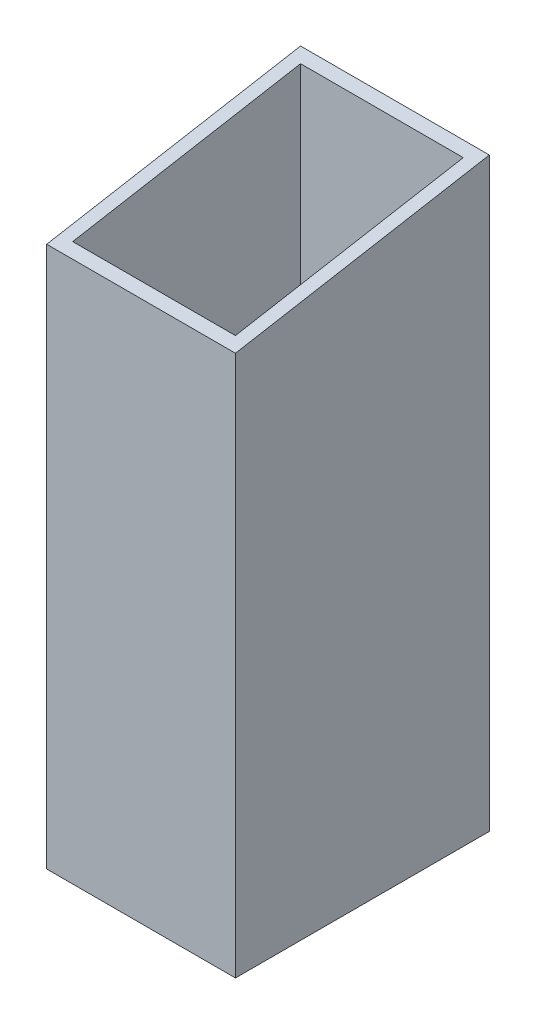
ISO-10303-21;
HEADER;
FILE_DESCRIPTION(('STEP AP214'),'2;1');
FILE_NAME('part.step','',(''),(''),'','','');
FILE_SCHEMA(('AUTOMOTIVE_DESIGN { 1 0 10303 214 1 1 1 1 }'));
ENDSEC;
DATA;
#1=APPLICATION_CONTEXT('core data for automotive mechanical design processes');
#2=APPLICATION_PROTOCOL_DEFINITION('international standard','automotive_design',2000,#1);
#3=PRODUCT_CONTEXT('',#1,'mechanical');
#4=PRODUCT('Part','Part','',(#3));
#5=PRODUCT_RELATED_PRODUCT_CATEGORY('part','',(#4));
#6=PRODUCT_DEFINITION_FORMATION('','',#4);
#7=PRODUCT_DEFINITION_CONTEXT('part definition',#1,'design');
#8=PRODUCT_DEFINITION('design','',#6,#7);
#9=PRODUCT_DEFINITION_SHAPE('','',#8);
#10=(LENGTH_UNIT() NAMED_UNIT(*) SI_UNIT(.MILLI.,.METRE.));
#11=(NAMED_UNIT(*) PLANE_ANGLE_UNIT() SI_UNIT($,.RADIAN.));
#12=(NAMED_UNIT(*) SI_UNIT($,.STERADIAN.) SOLID_ANGLE_UNIT());
#13=UNCERTAINTY_MEASURE_WITH_UNIT(LENGTH_MEASURE(1.E-05),#10,'distance_accuracy_value','');
#14=(GEOMETRIC_REPRESENTATION_CONTEXT(3) GLOBAL_UNCERTAINTY_ASSIGNED_CONTEXT((#13)) GLOBAL_UNIT_ASSIGNED_CONTEXT((#10,
#11,#12)) REPRESENTATION_CONTEXT('',''));
#15=CARTESIAN_POINT('',(0.,0.,0.));
#16=DIRECTION('',(0.,0.,1.));
#17=DIRECTION('',(1.,0.,0.));
#18=AXIS2_PLACEMENT_3D('',#15,#16,#17);
#19=CARTESIAN_POINT('',(0.,90.,0.));
#20=DIRECTION('',(1.,0.,0.));
#21=DIRECTION('',(0.,0.,-1.));
#22=AXIS2_PLACEMENT_3D('',#19,#20,#21);
#23=PLANE('',#22);
#24=DIRECTION('',(0.,-0.173648177666931,0.984807753012208));
#25=VECTOR('',#24,1.);
#26=CARTESIAN_POINT('',(0.,83.3306072051494,-1.1759938946748));
#27=LINE('',#26,#25);
#28=CARTESIAN_POINT('',(0.,90.,-39.));
#29=VERTEX_POINT('',#28);
#30=CARTESIAN_POINT('',(0.,83.1232477523698,0.));
#31=VERTEX_POINT('',#30);
#32=EDGE_CURVE('E121',#29,#31,#27,.T.);
#33=ORIENTED_EDGE('',*,*,#32,.F.);
#34=DIRECTION('',(0.,-1.,0.));
#35=VECTOR('',#34,1.);
#36=CARTESIAN_POINT('',(0.,90.,-39.));
#37=LINE('',#36,#35);
#38=CARTESIAN_POINT('',(0.,0.,-39.));
#39=VERTEX_POINT('',#38);
#40=EDGE_CURVE('E106',#29,#39,#37,.T.);
#41=ORIENTED_EDGE('',*,*,#40,.T.);
#42=DIRECTION('',(0.,0.,1.));
#43=VECTOR('',#42,1.);
#44=CARTESIAN_POINT('',(0.,0.,0.));
#45=LINE('',#44,#43);
#46=CARTESIAN_POINT('',(0.,0.,0.));
#47=VERTEX_POINT('',#46);
#48=EDGE_CURVE('E136',#39,#47,#45,.T.);
#49=ORIENTED_EDGE('',*,*,#48,.T.);
#50=DIRECTION('',(0.,-1.,0.));
#51=VECTOR('',#50,1.);
#52=CARTESIAN_POINT('',(0.,90.,0.));
#53=LINE('',#52,#51);
#54=EDGE_CURVE('E49',#31,#47,#53,.T.);
#55=ORIENTED_EDGE('',*,*,#54,.F.);
#56=EDGE_LOOP('',(#33,#41,#49,#55));
#57=FACE_BOUND('',#56,.T.);
#58=ADVANCED_FACE('F41',(#57),#23,.F.);
#59=CARTESIAN_POINT('',(0.,90.,0.));
#60=DIRECTION('',(0.,0.,-1.));
#61=DIRECTION('',(-1.,0.,0.));
#62=AXIS2_PLACEMENT_3D('',#59,#60,#61);
#63=PLANE('',#62);
#64=DIRECTION('',(1.,0.,0.));
#65=VECTOR('',#64,1.);
#66=CARTESIAN_POINT('',(-127.854898224511,83.1232477523698,0.));
#67=LINE('',#66,#65);
#68=CARTESIAN_POINT('',(29.,83.1232477523698,0.));
#69=VERTEX_POINT('',#68);
#70=EDGE_CURVE('E56',#31,#69,#67,.T.);
#71=ORIENTED_EDGE('',*,*,#70,.F.);
#72=ORIENTED_EDGE('',*,*,#54,.T.);
#73=DIRECTION('',(1.,0.,0.));
#74=VECTOR('',#73,1.);
#75=CARTESIAN_POINT('',(0.,0.,0.));
#76=LINE('',#75,#74);
#77=CARTESIAN_POINT('',(29.,0.,0.));
#78=VERTEX_POINT('',#77);
#79=EDGE_CURVE('E139',#47,#78,#76,.T.);
#80=ORIENTED_EDGE('',*,*,#79,.T.);
#81=DIRECTION('',(0.,-1.,0.));
#82=VECTOR('',#81,1.);
#83=CARTESIAN_POINT('',(29.,90.,0.));
#84=LINE('',#83,#82);
#85=EDGE_CURVE('E148',#69,#78,#84,.T.);
#86=ORIENTED_EDGE('',*,*,#85,.F.);
#87=EDGE_LOOP('',(#71,#72,#80,#86));
#88=FACE_BOUND('',#87,.T.);
#89=ADVANCED_FACE('F152',(#88),#63,.F.);
#90=CARTESIAN_POINT('',(29.,90.,0.));
#91=DIRECTION('',(-1.,0.,0.));
#92=DIRECTION('',(0.,0.,1.));
#93=AXIS2_PLACEMENT_3D('',#90,#91,#92);
#94=PLANE('',#93);
#95=DIRECTION('',(0.,0.173648177666931,-0.984807753012208));
#96=VECTOR('',#95,1.);
#97=CARTESIAN_POINT('',(29.,83.3306072051494,-1.1759938946748));
#98=LINE('',#97,#96);
#99=CARTESIAN_POINT('',(29.,90.,-39.));
#100=VERTEX_POINT('',#99);
#101=EDGE_CURVE('E64',#69,#100,#98,.T.);
#102=ORIENTED_EDGE('',*,*,#101,.F.);
#103=ORIENTED_EDGE('',*,*,#85,.T.);
#104=DIRECTION('',(0.,0.,-1.));
#105=VECTOR('',#104,1.);
#106=CARTESIAN_POINT('',(29.,0.,0.));
#107=LINE('',#106,#105);
#108=CARTESIAN_POINT('',(29.,0.,-39.));
#109=VERTEX_POINT('',#108);
#110=EDGE_CURVE('E130',#78,#109,#107,.T.);
#111=ORIENTED_EDGE('',*,*,#110,.T.);
#112=DIRECTION('',(0.,-1.,0.));
#113=VECTOR('',#112,1.);
#114=CARTESIAN_POINT('',(29.,90.,-39.));
#115=LINE('',#114,#113);
#116=EDGE_CURVE('E118',#100,#109,#115,.T.);
#117=ORIENTED_EDGE('',*,*,#116,.F.);
#118=EDGE_LOOP('',(#102,#103,#111,#117));
#119=FACE_BOUND('',#118,.T.);
#120=ADVANCED_FACE('F156',(#119),#94,.F.);
#121=CARTESIAN_POINT('',(0.,90.,-39.));
#122=DIRECTION('',(0.,0.,1.));
#123=DIRECTION('',(1.,0.,0.));
#124=AXIS2_PLACEMENT_3D('',#121,#122,#123);
#125=PLANE('',#124);
#126=DIRECTION('',(-1.,0.,0.));
#127=VECTOR('',#126,1.);
#128=CARTESIAN_POINT('',(0.,0.,-39.));
#129=LINE('',#128,#127);
#130=EDGE_CURVE('E113',#109,#39,#129,.T.);
#131=ORIENTED_EDGE('',*,*,#130,.T.);
#132=ORIENTED_EDGE('',*,*,#40,.F.);
#133=DIRECTION('',(-1.,0.,0.));
#134=VECTOR('',#133,1.);
#135=CARTESIAN_POINT('',(0.,90.,-39.));
#136=LINE('',#135,#134);
#137=EDGE_CURVE('E111',#100,#29,#136,.T.);
#138=ORIENTED_EDGE('',*,*,#137,.F.);
#139=ORIENTED_EDGE('',*,*,#116,.T.);
#140=EDGE_LOOP('',(#131,#132,#138,#139));
#141=FACE_BOUND('',#140,.T.);
#142=ADVANCED_FACE('F108',(#141),#125,.F.);
#143=CARTESIAN_POINT('',(0.,0.,0.));
#144=DIRECTION('',(0.,-1.,0.));
#145=DIRECTION('',(0.,0.,-1.));
#146=AXIS2_PLACEMENT_3D('',#143,#144,#145);
#147=PLANE('',#146);
#148=ORIENTED_EDGE('',*,*,#48,.F.);
#149=ORIENTED_EDGE('',*,*,#130,.F.);
#150=ORIENTED_EDGE('',*,*,#110,.F.);
#151=ORIENTED_EDGE('',*,*,#79,.F.);
#152=EDGE_LOOP('',(#148,#149,#150,#151));
#153=FACE_BOUND('',#152,.T.);
#154=ADVANCED_FACE('F155',(#153),#147,.T.);
#155=CARTESIAN_POINT('',(-127.854898224511,90.,-39.));
#156=DIRECTION('',(0.,0.984807753012208,0.173648177666931));
#157=DIRECTION('',(0.,-0.173648177666931,0.984807753012208));
#158=AXIS2_PLACEMENT_3D('',#155,#156,#157);
#159=PLANE('',#158);
#160=DIRECTION('',(0.,-0.173648177666931,0.984807753012208));
#161=VECTOR('',#160,1.);
#162=CARTESIAN_POINT('',(2.,83.3306072051494,-1.1759938946748));
#163=LINE('',#162,#161);
#164=CARTESIAN_POINT('',(2.,89.6473460385831,-37.));
#165=VERTEX_POINT('',#164);
#166=CARTESIAN_POINT('',(2.,83.4759017137868,-2.));
#167=VERTEX_POINT('',#166);
#168=EDGE_CURVE('E168',#165,#167,#163,.T.);
#169=ORIENTED_EDGE('',*,*,#168,.F.);
#170=DIRECTION('',(-1.,0.,0.));
#171=VECTOR('',#170,1.);
#172=CARTESIAN_POINT('',(0.,89.6473460385831,-37.));
#173=LINE('',#172,#171);
#174=CARTESIAN_POINT('',(27.,89.6473460385831,-37.));
#175=VERTEX_POINT('',#174);
#176=EDGE_CURVE('E11',#175,#165,#173,.T.);
#177=ORIENTED_EDGE('',*,*,#176,.F.);
#178=DIRECTION('',(0.,0.173648177666931,-0.984807753012208));
#179=VECTOR('',#178,1.);
#180=CARTESIAN_POINT('',(27.,83.3306072051494,-1.1759938946748));
#181=LINE('',#180,#179);
#182=CARTESIAN_POINT('',(27.,83.4759017137868,-2.));
#183=VERTEX_POINT('',#182);
#184=EDGE_CURVE('E158',#183,#175,#181,.T.);
#185=ORIENTED_EDGE('',*,*,#184,.F.);
#186=DIRECTION('',(1.,0.,0.));
#187=VECTOR('',#186,1.);
#188=CARTESIAN_POINT('',(0.,83.4759017137868,-2.));
#189=LINE('',#188,#187);
#190=EDGE_CURVE('E162',#167,#183,#189,.T.);
#191=ORIENTED_EDGE('',*,*,#190,.F.);
#192=EDGE_LOOP('',(#169,#177,#185,#191));
#193=FACE_BOUND('',#192,.T.);
#194=ORIENTED_EDGE('',*,*,#137,.T.);
#195=ORIENTED_EDGE('',*,*,#32,.T.);
#196=ORIENTED_EDGE('',*,*,#70,.T.);
#197=ORIENTED_EDGE('',*,*,#101,.T.);
#198=EDGE_LOOP('',(#194,#195,#196,#197));
#199=FACE_BOUND('',#198,.T.);
#200=ADVANCED_FACE('F126',(#193,#199),#159,.T.);
#201=CARTESIAN_POINT('',(0.,2.,0.));
#202=DIRECTION('',(0.,-1.,0.));
#203=DIRECTION('',(0.,0.,-1.));
#204=AXIS2_PLACEMENT_3D('',#201,#202,#203);
#205=PLANE('',#204);
#206=DIRECTION('',(0.,0.,1.));
#207=VECTOR('',#206,1.);
#208=CARTESIAN_POINT('',(2.,2.,0.));
#209=LINE('',#208,#207);
#210=CARTESIAN_POINT('',(2.,2.,-37.));
#211=VERTEX_POINT('',#210);
#212=CARTESIAN_POINT('',(2.,2.,-2.));
#213=VERTEX_POINT('',#212);
#214=EDGE_CURVE('E124',#211,#213,#209,.T.);
#215=ORIENTED_EDGE('',*,*,#214,.T.);
#216=DIRECTION('',(1.,0.,0.));
#217=VECTOR('',#216,1.);
#218=CARTESIAN_POINT('',(0.,2.,-2.));
#219=LINE('',#218,#217);
#220=CARTESIAN_POINT('',(27.,2.,-2.));
#221=VERTEX_POINT('',#220);
#222=EDGE_CURVE('E177',#213,#221,#219,.T.);
#223=ORIENTED_EDGE('',*,*,#222,.T.);
#224=DIRECTION('',(0.,0.,-1.));
#225=VECTOR('',#224,1.);
#226=CARTESIAN_POINT('',(27.,2.,0.));
#227=LINE('',#226,#225);
#228=CARTESIAN_POINT('',(27.,2.,-37.));
#229=VERTEX_POINT('',#228);
#230=EDGE_CURVE('E188',#221,#229,#227,.T.);
#231=ORIENTED_EDGE('',*,*,#230,.T.);
#232=DIRECTION('',(-1.,0.,0.));
#233=VECTOR('',#232,1.);
#234=CARTESIAN_POINT('',(0.,2.,-37.));
#235=LINE('',#234,#233);
#236=EDGE_CURVE('E134',#229,#211,#235,.T.);
#237=ORIENTED_EDGE('',*,*,#236,.T.);
#238=EDGE_LOOP('',(#215,#223,#231,#237));
#239=FACE_BOUND('',#238,.T.);
#240=ADVANCED_FACE('F203',(#239),#205,.F.);
#241=CARTESIAN_POINT('',(0.,90.,-37.));
#242=DIRECTION('',(0.,0.,1.));
#243=DIRECTION('',(1.,0.,0.));
#244=AXIS2_PLACEMENT_3D('',#241,#242,#243);
#245=PLANE('',#244);
#246=DIRECTION('',(0.,-1.,0.));
#247=VECTOR('',#246,1.);
#248=CARTESIAN_POINT('',(27.,90.,-37.));
#249=LINE('',#248,#247);
#250=EDGE_CURVE('E184',#175,#229,#249,.T.);
#251=ORIENTED_EDGE('',*,*,#250,.F.);
#252=ORIENTED_EDGE('',*,*,#176,.T.);
#253=DIRECTION('',(0.,-1.,0.));
#254=VECTOR('',#253,1.);
#255=CARTESIAN_POINT('',(2.,90.,-37.));
#256=LINE('',#255,#254);
#257=EDGE_CURVE('E181',#165,#211,#256,.T.);
#258=ORIENTED_EDGE('',*,*,#257,.T.);
#259=ORIENTED_EDGE('',*,*,#236,.F.);
#260=EDGE_LOOP('',(#251,#252,#258,#259));
#261=FACE_BOUND('',#260,.T.);
#262=ADVANCED_FACE('F206',(#261),#245,.T.);
#263=CARTESIAN_POINT('',(27.,90.,0.));
#264=DIRECTION('',(-1.,0.,0.));
#265=DIRECTION('',(0.,0.,1.));
#266=AXIS2_PLACEMENT_3D('',#263,#264,#265);
#267=PLANE('',#266);
#268=DIRECTION('',(0.,-1.,0.));
#269=VECTOR('',#268,1.);
#270=CARTESIAN_POINT('',(27.,90.,-2.));
#271=LINE('',#270,#269);
#272=EDGE_CURVE('E180',#183,#221,#271,.T.);
#273=ORIENTED_EDGE('',*,*,#272,.F.);
#274=ORIENTED_EDGE('',*,*,#184,.T.);
#275=ORIENTED_EDGE('',*,*,#250,.T.);
#276=ORIENTED_EDGE('',*,*,#230,.F.);
#277=EDGE_LOOP('',(#273,#274,#275,#276));
#278=FACE_BOUND('',#277,.T.);
#279=ADVANCED_FACE('F198',(#278),#267,.T.);
#280=CARTESIAN_POINT('',(0.,90.,-2.));
#281=DIRECTION('',(0.,0.,-1.));
#282=DIRECTION('',(-1.,0.,0.));
#283=AXIS2_PLACEMENT_3D('',#280,#281,#282);
#284=PLANE('',#283);
#285=DIRECTION('',(0.,-1.,0.));
#286=VECTOR('',#285,1.);
#287=CARTESIAN_POINT('',(2.,90.,-2.));
#288=LINE('',#287,#286);
#289=EDGE_CURVE('E140',#167,#213,#288,.T.);
#290=ORIENTED_EDGE('',*,*,#289,.F.);
#291=ORIENTED_EDGE('',*,*,#190,.T.);
#292=ORIENTED_EDGE('',*,*,#272,.T.);
#293=ORIENTED_EDGE('',*,*,#222,.F.);
#294=EDGE_LOOP('',(#290,#291,#292,#293));
#295=FACE_BOUND('',#294,.T.);
#296=ADVANCED_FACE('F213',(#295),#284,.T.);
#297=CARTESIAN_POINT('',(2.,90.,0.));
#298=DIRECTION('',(1.,0.,0.));
#299=DIRECTION('',(0.,0.,-1.));
#300=AXIS2_PLACEMENT_3D('',#297,#298,#299);
#301=PLANE('',#300);
#302=ORIENTED_EDGE('',*,*,#257,.F.);
#303=ORIENTED_EDGE('',*,*,#168,.T.);
#304=ORIENTED_EDGE('',*,*,#289,.T.);
#305=ORIENTED_EDGE('',*,*,#214,.F.);
#306=EDGE_LOOP('',(#302,#303,#304,#305));
#307=FACE_BOUND('',#306,.T.);
#308=ADVANCED_FACE('F210',(#307),#301,.T.);
#309=CLOSED_SHELL('',(#58,#89,#120,#142,#154,#200,#240,#262,#279,#296,#308));
#310=MANIFOLD_SOLID_BREP('B2',#309);
#311=ADVANCED_BREP_SHAPE_REPRESENTATION('',(#18,#310),#14);
#312=SHAPE_DEFINITION_REPRESENTATION(#9,#311);
ENDSEC;
END-ISO-10303-21;
